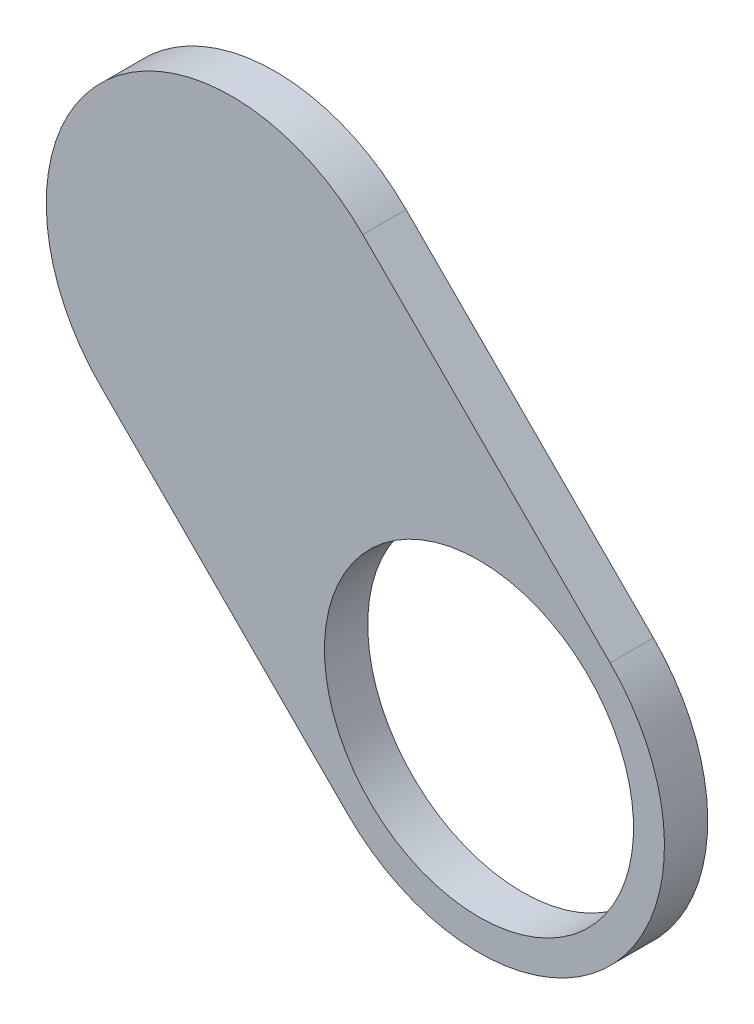
ISO-10303-21;
HEADER;
FILE_DESCRIPTION(('STEP AP214'),'2;1');
FILE_NAME('part.step','',(''),(''),'','','');
FILE_SCHEMA(('AUTOMOTIVE_DESIGN { 1 0 10303 214 1 1 1 1 }'));
ENDSEC;
DATA;
#1=APPLICATION_CONTEXT('core data for automotive mechanical design processes');
#2=APPLICATION_PROTOCOL_DEFINITION('international standard','automotive_design',2000,#1);
#3=PRODUCT_CONTEXT('',#1,'mechanical');
#4=PRODUCT('Part','Part','',(#3));
#5=PRODUCT_RELATED_PRODUCT_CATEGORY('part','',(#4));
#6=PRODUCT_DEFINITION_FORMATION('','',#4);
#7=PRODUCT_DEFINITION_CONTEXT('part definition',#1,'design');
#8=PRODUCT_DEFINITION('design','',#6,#7);
#9=PRODUCT_DEFINITION_SHAPE('','',#8);
#10=(LENGTH_UNIT() NAMED_UNIT(*) SI_UNIT(.MILLI.,.METRE.));
#11=(NAMED_UNIT(*) PLANE_ANGLE_UNIT() SI_UNIT($,.RADIAN.));
#12=(NAMED_UNIT(*) SI_UNIT($,.STERADIAN.) SOLID_ANGLE_UNIT());
#13=UNCERTAINTY_MEASURE_WITH_UNIT(LENGTH_MEASURE(1.E-05),#10,'distance_accuracy_value','');
#14=(GEOMETRIC_REPRESENTATION_CONTEXT(3) GLOBAL_UNCERTAINTY_ASSIGNED_CONTEXT((#13)) GLOBAL_UNIT_ASSIGNED_CONTEXT((#10,
#11,#12)) REPRESENTATION_CONTEXT('',''));
#15=CARTESIAN_POINT('',(0.,0.,0.));
#16=DIRECTION('',(0.,0.,1.));
#17=DIRECTION('',(1.,0.,0.));
#18=AXIS2_PLACEMENT_3D('',#15,#16,#17);
#19=CARTESIAN_POINT('',(125.2,-63.05,-0.045));
#20=DIRECTION('',(0.,0.,-1.));
#21=DIRECTION('',(0.,-1.,0.));
#22=AXIS2_PLACEMENT_3D('',#19,#20,#21);
#23=CYLINDRICAL_SURFACE('',#22,0.125);
#24=CARTESIAN_POINT('',(125.2,-63.05,1.6));
#25=DIRECTION('',(0.,0.,-1.));
#26=DIRECTION('',(0.,-1.,0.));
#27=AXIS2_PLACEMENT_3D('',#24,#25,#26);
#28=CIRCLE('',#27,0.125);
#29=CARTESIAN_POINT('',(125.2,-63.175,1.6));
#30=VERTEX_POINT('',#29);
#31=EDGE_CURVE('E128',#30,#30,#28,.T.);
#32=ORIENTED_EDGE('',*,*,#31,.T.);
#33=DIRECTION('',(0.,0.,1.));
#34=VECTOR('',#33,1.);
#35=CARTESIAN_POINT('',(125.2,-63.175,-0.045));
#36=LINE('',#35,#34);
#37=CARTESIAN_POINT('',(125.2,-63.175,1.635));
#38=VERTEX_POINT('',#37);
#39=EDGE_CURVE('E11',#30,#38,#36,.T.);
#40=ORIENTED_EDGE('',*,*,#39,.T.);
#41=CARTESIAN_POINT('',(125.2,-63.05,1.635));
#42=DIRECTION('',(0.,0.,-1.));
#43=DIRECTION('',(0.,-1.,0.));
#44=AXIS2_PLACEMENT_3D('',#41,#42,#43);
#45=CIRCLE('',#44,0.125);
#46=EDGE_CURVE('E20',#38,#38,#45,.T.);
#47=ORIENTED_EDGE('',*,*,#46,.F.);
#48=ORIENTED_EDGE('',*,*,#39,.F.);
#49=EDGE_LOOP('',(#32,#40,#47,#48));
#50=FACE_BOUND('',#49,.T.);
#51=ADVANCED_FACE('F17',(#50),#23,.F.);
#52=CARTESIAN_POINT('',(124.893933,-62.956066,1.6));
#53=DIRECTION('',(0.707106781186548,0.707106781186548,0.));
#54=DIRECTION('',(0.,0.,-1.));
#55=AXIS2_PLACEMENT_3D('',#52,#53,#54);
#56=PLANE('',#55);
#57=DIRECTION('',(0.707106781186548,-0.707106781186548,0.));
#58=VECTOR('',#57,1.);
#59=CARTESIAN_POINT('',(124.893933,-62.956066,1.6));
#60=LINE('',#59,#58);
#61=CARTESIAN_POINT('',(124.893933,-62.956066,1.6));
#62=VERTEX_POINT('',#61);
#63=CARTESIAN_POINT('',(125.093933,-63.156066,1.6));
#64=VERTEX_POINT('',#63);
#65=EDGE_CURVE('E55',#62,#64,#60,.T.);
#66=ORIENTED_EDGE('',*,*,#65,.T.);
#67=DIRECTION('',(0.,0.,1.));
#68=VECTOR('',#67,1.);
#69=CARTESIAN_POINT('',(125.093933,-63.156066,1.6));
#70=LINE('',#69,#68);
#71=CARTESIAN_POINT('',(125.093933,-63.156066,1.635));
#72=VERTEX_POINT('',#71);
#73=EDGE_CURVE('E96',#64,#72,#70,.T.);
#74=ORIENTED_EDGE('',*,*,#73,.T.);
#75=DIRECTION('',(0.707106781186548,-0.707106781186548,0.));
#76=VECTOR('',#75,1.);
#77=CARTESIAN_POINT('',(124.893933,-62.956066,1.635));
#78=LINE('',#77,#76);
#79=CARTESIAN_POINT('',(124.893933,-62.956066,1.635));
#80=VERTEX_POINT('',#79);
#81=EDGE_CURVE('E138',#80,#72,#78,.T.);
#82=ORIENTED_EDGE('',*,*,#81,.F.);
#83=DIRECTION('',(0.,0.,1.));
#84=VECTOR('',#83,1.);
#85=CARTESIAN_POINT('',(124.893933,-62.956066,1.6));
#86=LINE('',#85,#84);
#87=EDGE_CURVE('E121',#62,#80,#86,.T.);
#88=ORIENTED_EDGE('',*,*,#87,.F.);
#89=EDGE_LOOP('',(#66,#74,#82,#88));
#90=FACE_BOUND('',#89,.T.);
#91=ADVANCED_FACE('F159',(#90),#56,.F.);
#92=CARTESIAN_POINT('',(125.306066,-62.943933,1.635));
#93=DIRECTION('',(0.,0.,1.));
#94=DIRECTION('',(1.,0.,0.));
#95=AXIS2_PLACEMENT_3D('',#92,#93,#94);
#96=PLANE('',#95);
#97=ORIENTED_EDGE('',*,*,#46,.T.);
#98=EDGE_LOOP('',(#97));
#99=FACE_BOUND('',#98,.T.);
#100=DIRECTION('',(-0.707106781186548,0.707106781186548,0.));
#101=VECTOR('',#100,1.);
#102=CARTESIAN_POINT('',(125.306066,-62.943933,1.635));
#103=LINE('',#102,#101);
#104=CARTESIAN_POINT('',(125.306066,-62.943933,1.635));
#105=VERTEX_POINT('',#104);
#106=CARTESIAN_POINT('',(125.106066,-62.743933,1.635));
#107=VERTEX_POINT('',#106);
#108=EDGE_CURVE('E106',#105,#107,#103,.T.);
#109=ORIENTED_EDGE('',*,*,#108,.T.);
#110=CARTESIAN_POINT('',(124.9999995,-62.8499995,1.635));
#111=DIRECTION('',(0.,0.,1.));
#112=DIRECTION('',(0.707106781186548,0.707106781186548,0.));
#113=AXIS2_PLACEMENT_3D('',#110,#111,#112);
#114=CIRCLE('',#113,0.150000682813);
#115=EDGE_CURVE('E77',#107,#80,#114,.T.);
#116=ORIENTED_EDGE('',*,*,#115,.T.);
#117=ORIENTED_EDGE('',*,*,#81,.T.);
#118=CARTESIAN_POINT('',(125.1999995,-63.0499995,1.635));
#119=DIRECTION('',(0.,0.,1.));
#120=DIRECTION('',(-0.707106781186548,-0.707106781186548,0.));
#121=AXIS2_PLACEMENT_3D('',#118,#119,#120);
#122=CIRCLE('',#121,0.150000682813);
#123=EDGE_CURVE('E65',#72,#105,#122,.T.);
#124=ORIENTED_EDGE('',*,*,#123,.T.);
#125=EDGE_LOOP('',(#109,#116,#117,#124));
#126=FACE_BOUND('',#125,.T.);
#127=ADVANCED_FACE('F146',(#99,#126),#96,.T.);
#128=CARTESIAN_POINT('',(125.306066,-62.943933,1.6));
#129=DIRECTION('',(0.,0.,1.));
#130=DIRECTION('',(1.,0.,0.));
#131=AXIS2_PLACEMENT_3D('',#128,#129,#130);
#132=PLANE('',#131);
#133=ORIENTED_EDGE('',*,*,#31,.F.);
#134=EDGE_LOOP('',(#133));
#135=FACE_BOUND('',#134,.T.);
#136=CARTESIAN_POINT('',(125.1999995,-63.0499995,1.6));
#137=DIRECTION('',(0.,0.,1.));
#138=DIRECTION('',(-0.707106781186548,-0.707106781186548,0.));
#139=AXIS2_PLACEMENT_3D('',#136,#137,#138);
#140=CIRCLE('',#139,0.150000682813);
#141=CARTESIAN_POINT('',(125.306066,-62.943933,1.6));
#142=VERTEX_POINT('',#141);
#143=EDGE_CURVE('E91',#64,#142,#140,.T.);
#144=ORIENTED_EDGE('',*,*,#143,.F.);
#145=ORIENTED_EDGE('',*,*,#65,.F.);
#146=CARTESIAN_POINT('',(124.9999995,-62.8499995,1.6));
#147=DIRECTION('',(0.,0.,1.));
#148=DIRECTION('',(0.707106781186548,0.707106781186548,0.));
#149=AXIS2_PLACEMENT_3D('',#146,#147,#148);
#150=CIRCLE('',#149,0.150000682813);
#151=CARTESIAN_POINT('',(125.106066,-62.743933,1.6));
#152=VERTEX_POINT('',#151);
#153=EDGE_CURVE('E111',#152,#62,#150,.T.);
#154=ORIENTED_EDGE('',*,*,#153,.F.);
#155=DIRECTION('',(-0.707106781186548,0.707106781186548,0.));
#156=VECTOR('',#155,1.);
#157=CARTESIAN_POINT('',(125.306066,-62.943933,1.6));
#158=LINE('',#157,#156);
#159=EDGE_CURVE('E105',#142,#152,#158,.T.);
#160=ORIENTED_EDGE('',*,*,#159,.F.);
#161=EDGE_LOOP('',(#144,#145,#154,#160));
#162=FACE_BOUND('',#161,.T.);
#163=ADVANCED_FACE('F109',(#135,#162),#132,.F.);
#164=CARTESIAN_POINT('',(124.9999995,-62.8499995,1.6));
#165=DIRECTION('',(0.,0.,-1.));
#166=DIRECTION('',(0.707106781186548,0.707106781186548,0.));
#167=AXIS2_PLACEMENT_3D('',#164,#165,#166);
#168=CYLINDRICAL_SURFACE('',#167,0.150000682813);
#169=ORIENTED_EDGE('',*,*,#153,.T.);
#170=ORIENTED_EDGE('',*,*,#87,.T.);
#171=ORIENTED_EDGE('',*,*,#115,.F.);
#172=DIRECTION('',(0.,0.,1.));
#173=VECTOR('',#172,1.);
#174=CARTESIAN_POINT('',(125.106066,-62.743933,1.6));
#175=LINE('',#174,#173);
#176=EDGE_CURVE('E113',#152,#107,#175,.T.);
#177=ORIENTED_EDGE('',*,*,#176,.F.);
#178=EDGE_LOOP('',(#169,#170,#171,#177));
#179=FACE_BOUND('',#178,.T.);
#180=ADVANCED_FACE('F150',(#179),#168,.T.);
#181=CARTESIAN_POINT('',(125.1999995,-63.0499995,1.6));
#182=DIRECTION('',(0.,0.,-1.));
#183=DIRECTION('',(-0.707106781186548,-0.707106781186548,0.));
#184=AXIS2_PLACEMENT_3D('',#181,#182,#183);
#185=CYLINDRICAL_SURFACE('',#184,0.150000682813);
#186=ORIENTED_EDGE('',*,*,#143,.T.);
#187=DIRECTION('',(0.,0.,1.));
#188=VECTOR('',#187,1.);
#189=CARTESIAN_POINT('',(125.306066,-62.943933,1.6));
#190=LINE('',#189,#188);
#191=EDGE_CURVE('E94',#142,#105,#190,.T.);
#192=ORIENTED_EDGE('',*,*,#191,.T.);
#193=ORIENTED_EDGE('',*,*,#123,.F.);
#194=ORIENTED_EDGE('',*,*,#73,.F.);
#195=EDGE_LOOP('',(#186,#192,#193,#194));
#196=FACE_BOUND('',#195,.T.);
#197=ADVANCED_FACE('F93',(#196),#185,.T.);
#198=CARTESIAN_POINT('',(125.306066,-62.943933,1.6));
#199=DIRECTION('',(-0.707106781186548,-0.707106781186548,0.));
#200=DIRECTION('',(-0.707106781186548,0.707106781186548,0.));
#201=AXIS2_PLACEMENT_3D('',#198,#199,#200);
#202=PLANE('',#201);
#203=ORIENTED_EDGE('',*,*,#159,.T.);
#204=ORIENTED_EDGE('',*,*,#176,.T.);
#205=ORIENTED_EDGE('',*,*,#108,.F.);
#206=ORIENTED_EDGE('',*,*,#191,.F.);
#207=EDGE_LOOP('',(#203,#204,#205,#206));
#208=FACE_BOUND('',#207,.T.);
#209=ADVANCED_FACE('F103',(#208),#202,.F.);
#210=CLOSED_SHELL('',(#51,#91,#127,#163,#180,#197,#209));
#211=MANIFOLD_SOLID_BREP('B1',#210);
#212=ADVANCED_BREP_SHAPE_REPRESENTATION('',(#18,#211),#14);
#213=SHAPE_DEFINITION_REPRESENTATION(#9,#212);
ENDSEC;
END-ISO-10303-21;
